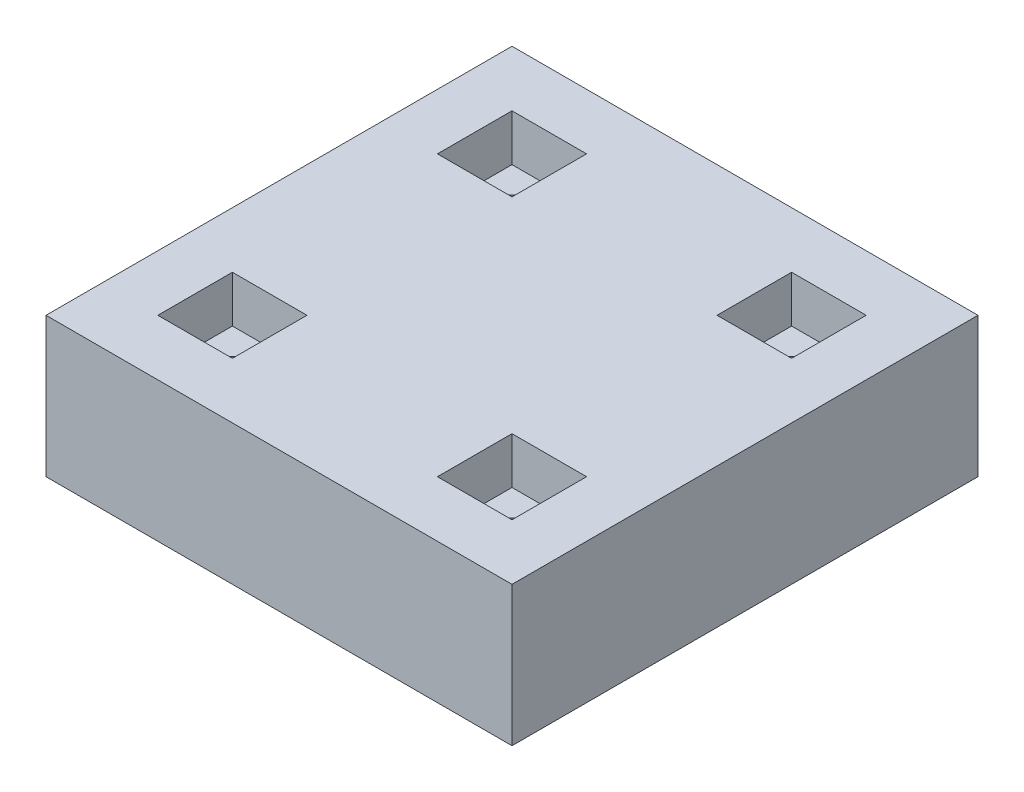
ISO-10303-21;
HEADER;
FILE_DESCRIPTION(('STEP AP214'),'2;1');
FILE_NAME('part.step','',(''),(''),'','','');
FILE_SCHEMA(('AUTOMOTIVE_DESIGN { 1 0 10303 214 1 1 1 1 }'));
ENDSEC;
DATA;
#1=APPLICATION_CONTEXT('core data for automotive mechanical design processes');
#2=APPLICATION_PROTOCOL_DEFINITION('international standard','automotive_design',2000,#1);
#3=PRODUCT_CONTEXT('',#1,'mechanical');
#4=PRODUCT('Part','Part','',(#3));
#5=PRODUCT_RELATED_PRODUCT_CATEGORY('part','',(#4));
#6=PRODUCT_DEFINITION_FORMATION('','',#4);
#7=PRODUCT_DEFINITION_CONTEXT('part definition',#1,'design');
#8=PRODUCT_DEFINITION('design','',#6,#7);
#9=PRODUCT_DEFINITION_SHAPE('','',#8);
#10=(LENGTH_UNIT() NAMED_UNIT(*) SI_UNIT(.MILLI.,.METRE.));
#11=(NAMED_UNIT(*) PLANE_ANGLE_UNIT() SI_UNIT($,.RADIAN.));
#12=(NAMED_UNIT(*) SI_UNIT($,.STERADIAN.) SOLID_ANGLE_UNIT());
#13=UNCERTAINTY_MEASURE_WITH_UNIT(LENGTH_MEASURE(1.E-05),#10,'distance_accuracy_value','');
#14=(GEOMETRIC_REPRESENTATION_CONTEXT(3) GLOBAL_UNCERTAINTY_ASSIGNED_CONTEXT((#13)) GLOBAL_UNIT_ASSIGNED_CONTEXT((#10,
#11,#12)) REPRESENTATION_CONTEXT('',''));
#15=CARTESIAN_POINT('',(0.,0.,0.));
#16=DIRECTION('',(0.,0.,1.));
#17=DIRECTION('',(1.,0.,0.));
#18=AXIS2_PLACEMENT_3D('',#15,#16,#17);
#19=CARTESIAN_POINT('',(-15.,15.,15.));
#20=DIRECTION('',(0.,1.,0.));
#21=DIRECTION('',(0.,0.,1.));
#22=AXIS2_PLACEMENT_3D('',#19,#20,#21);
#23=CYLINDRICAL_SURFACE('',#22,1.65);
#24=CARTESIAN_POINT('',(-15.,0.,15.));
#25=DIRECTION('',(0.,1.,0.));
#26=DIRECTION('',(0.,0.,1.));
#27=AXIS2_PLACEMENT_3D('',#24,#25,#26);
#28=CIRCLE('',#27,1.65);
#29=CARTESIAN_POINT('',(-15.,0.,16.65));
#30=VERTEX_POINT('',#29);
#31=EDGE_CURVE('E322',#30,#30,#28,.T.);
#32=ORIENTED_EDGE('',*,*,#31,.F.);
#33=EDGE_LOOP('',(#32));
#34=FACE_BOUND('',#33,.T.);
#35=CARTESIAN_POINT('',(-15.,10.,15.));
#36=DIRECTION('',(0.,1.,0.));
#37=DIRECTION('',(0.,0.,1.));
#38=AXIS2_PLACEMENT_3D('',#35,#36,#37);
#39=CIRCLE('',#38,1.65);
#40=CARTESIAN_POINT('',(-15.,10.,16.65));
#41=VERTEX_POINT('',#40);
#42=EDGE_CURVE('E42',#41,#41,#39,.F.);
#43=ORIENTED_EDGE('',*,*,#42,.F.);
#44=EDGE_LOOP('',(#43));
#45=FACE_BOUND('',#44,.T.);
#46=ADVANCED_FACE('F38',(#34,#45),#23,.F.);
#47=CARTESIAN_POINT('',(14.9999999999999,15.,15.));
#48=DIRECTION('',(0.,1.,0.));
#49=DIRECTION('',(0.,0.,1.));
#50=AXIS2_PLACEMENT_3D('',#47,#48,#49);
#51=CYLINDRICAL_SURFACE('',#50,1.65);
#52=CARTESIAN_POINT('',(14.9999999999999,0.,15.));
#53=DIRECTION('',(0.,1.,0.));
#54=DIRECTION('',(0.,0.,1.));
#55=AXIS2_PLACEMENT_3D('',#52,#53,#54);
#56=CIRCLE('',#55,1.65);
#57=CARTESIAN_POINT('',(14.9999999999999,0.,16.65));
#58=VERTEX_POINT('',#57);
#59=EDGE_CURVE('E319',#58,#58,#56,.T.);
#60=ORIENTED_EDGE('',*,*,#59,.F.);
#61=EDGE_LOOP('',(#60));
#62=FACE_BOUND('',#61,.T.);
#63=CARTESIAN_POINT('',(14.9999999999999,10.,15.));
#64=DIRECTION('',(0.,1.,0.));
#65=DIRECTION('',(0.,0.,1.));
#66=AXIS2_PLACEMENT_3D('',#63,#64,#65);
#67=CIRCLE('',#66,1.65);
#68=CARTESIAN_POINT('',(14.9999999999999,10.,16.65));
#69=VERTEX_POINT('',#68);
#70=EDGE_CURVE('E355',#69,#69,#67,.F.);
#71=ORIENTED_EDGE('',*,*,#70,.F.);
#72=EDGE_LOOP('',(#71));
#73=FACE_BOUND('',#72,.T.);
#74=ADVANCED_FACE('F365',(#62,#73),#51,.F.);
#75=CARTESIAN_POINT('',(14.9999999999999,15.,-15.));
#76=DIRECTION('',(0.,1.,0.));
#77=DIRECTION('',(0.,0.,1.));
#78=AXIS2_PLACEMENT_3D('',#75,#76,#77);
#79=CYLINDRICAL_SURFACE('',#78,1.65);
#80=CARTESIAN_POINT('',(14.9999999999999,0.,-15.));
#81=DIRECTION('',(0.,1.,0.));
#82=DIRECTION('',(0.,0.,1.));
#83=AXIS2_PLACEMENT_3D('',#80,#81,#82);
#84=CIRCLE('',#83,1.65);
#85=CARTESIAN_POINT('',(14.9999999999999,0.,-13.35));
#86=VERTEX_POINT('',#85);
#87=EDGE_CURVE('E316',#86,#86,#84,.T.);
#88=ORIENTED_EDGE('',*,*,#87,.F.);
#89=EDGE_LOOP('',(#88));
#90=FACE_BOUND('',#89,.T.);
#91=CARTESIAN_POINT('',(14.9999999999999,10.,-15.));
#92=DIRECTION('',(0.,1.,0.));
#93=DIRECTION('',(0.,0.,1.));
#94=AXIS2_PLACEMENT_3D('',#91,#92,#93);
#95=CIRCLE('',#94,1.65);
#96=CARTESIAN_POINT('',(14.9999999999999,10.,-13.35));
#97=VERTEX_POINT('',#96);
#98=EDGE_CURVE('E353',#97,#97,#95,.F.);
#99=ORIENTED_EDGE('',*,*,#98,.F.);
#100=EDGE_LOOP('',(#99));
#101=FACE_BOUND('',#100,.T.);
#102=ADVANCED_FACE('F371',(#90,#101),#79,.F.);
#103=CARTESIAN_POINT('',(-25.,15.,-25.));
#104=DIRECTION('',(1.,0.,0.));
#105=DIRECTION('',(0.,0.,-1.));
#106=AXIS2_PLACEMENT_3D('',#103,#104,#105);
#107=PLANE('',#106);
#108=DIRECTION('',(0.,0.,1.));
#109=VECTOR('',#108,1.);
#110=CARTESIAN_POINT('',(-25.,0.,-25.));
#111=LINE('',#110,#109);
#112=CARTESIAN_POINT('',(-25.,0.,-25.));
#113=VERTEX_POINT('',#112);
#114=CARTESIAN_POINT('',(-25.,0.,25.));
#115=VERTEX_POINT('',#114);
#116=EDGE_CURVE('E325',#113,#115,#111,.T.);
#117=ORIENTED_EDGE('',*,*,#116,.T.);
#118=DIRECTION('',(0.,-1.,0.));
#119=VECTOR('',#118,1.);
#120=CARTESIAN_POINT('',(-25.,15.,25.));
#121=LINE('',#120,#119);
#122=CARTESIAN_POINT('',(-25.,15.,25.));
#123=VERTEX_POINT('',#122);
#124=EDGE_CURVE('E11',#123,#115,#121,.T.);
#125=ORIENTED_EDGE('',*,*,#124,.F.);
#126=DIRECTION('',(0.,0.,1.));
#127=VECTOR('',#126,1.);
#128=CARTESIAN_POINT('',(-25.,15.,-25.));
#129=LINE('',#128,#127);
#130=CARTESIAN_POINT('',(-25.,15.,-25.));
#131=VERTEX_POINT('',#130);
#132=EDGE_CURVE('E326',#131,#123,#129,.T.);
#133=ORIENTED_EDGE('',*,*,#132,.F.);
#134=DIRECTION('',(0.,-1.,0.));
#135=VECTOR('',#134,1.);
#136=CARTESIAN_POINT('',(-25.,15.,-25.));
#137=LINE('',#136,#135);
#138=EDGE_CURVE('E336',#131,#113,#137,.T.);
#139=ORIENTED_EDGE('',*,*,#138,.T.);
#140=EDGE_LOOP('',(#117,#125,#133,#139));
#141=FACE_BOUND('',#140,.T.);
#142=ADVANCED_FACE('F40',(#141),#107,.F.);
#143=CARTESIAN_POINT('',(25.,15.,25.));
#144=DIRECTION('',(0.,0.,-1.));
#145=DIRECTION('',(-1.,0.,0.));
#146=AXIS2_PLACEMENT_3D('',#143,#144,#145);
#147=PLANE('',#146);
#148=DIRECTION('',(1.,0.,0.));
#149=VECTOR('',#148,1.);
#150=CARTESIAN_POINT('',(25.,0.,25.));
#151=LINE('',#150,#149);
#152=CARTESIAN_POINT('',(25.,0.,25.));
#153=VERTEX_POINT('',#152);
#154=EDGE_CURVE('E339',#115,#153,#151,.T.);
#155=ORIENTED_EDGE('',*,*,#154,.T.);
#156=DIRECTION('',(0.,-1.,0.));
#157=VECTOR('',#156,1.);
#158=CARTESIAN_POINT('',(25.,15.,25.));
#159=LINE('',#158,#157);
#160=CARTESIAN_POINT('',(25.,15.,25.));
#161=VERTEX_POINT('',#160);
#162=EDGE_CURVE('E47',#161,#153,#159,.T.);
#163=ORIENTED_EDGE('',*,*,#162,.F.);
#164=DIRECTION('',(1.,0.,0.));
#165=VECTOR('',#164,1.);
#166=CARTESIAN_POINT('',(25.,15.,25.));
#167=LINE('',#166,#165);
#168=EDGE_CURVE('E329',#123,#161,#167,.T.);
#169=ORIENTED_EDGE('',*,*,#168,.F.);
#170=ORIENTED_EDGE('',*,*,#124,.T.);
#171=EDGE_LOOP('',(#155,#163,#169,#170));
#172=FACE_BOUND('',#171,.T.);
#173=ADVANCED_FACE('F392',(#172),#147,.F.);
#174=CARTESIAN_POINT('',(25.,15.,-25.));
#175=DIRECTION('',(-1.,0.,0.));
#176=DIRECTION('',(0.,0.,1.));
#177=AXIS2_PLACEMENT_3D('',#174,#175,#176);
#178=PLANE('',#177);
#179=DIRECTION('',(0.,0.,-1.));
#180=VECTOR('',#179,1.);
#181=CARTESIAN_POINT('',(25.,0.,-25.));
#182=LINE('',#181,#180);
#183=CARTESIAN_POINT('',(25.,0.,-25.));
#184=VERTEX_POINT('',#183);
#185=EDGE_CURVE('E341',#153,#184,#182,.T.);
#186=ORIENTED_EDGE('',*,*,#185,.T.);
#187=DIRECTION('',(0.,-1.,0.));
#188=VECTOR('',#187,1.);
#189=CARTESIAN_POINT('',(25.,15.,-25.));
#190=LINE('',#189,#188);
#191=CARTESIAN_POINT('',(25.,15.,-25.));
#192=VERTEX_POINT('',#191);
#193=EDGE_CURVE('E346',#192,#184,#190,.T.);
#194=ORIENTED_EDGE('',*,*,#193,.F.);
#195=DIRECTION('',(0.,0.,-1.));
#196=VECTOR('',#195,1.);
#197=CARTESIAN_POINT('',(25.,15.,-25.));
#198=LINE('',#197,#196);
#199=EDGE_CURVE('E332',#161,#192,#198,.T.);
#200=ORIENTED_EDGE('',*,*,#199,.F.);
#201=ORIENTED_EDGE('',*,*,#162,.T.);
#202=EDGE_LOOP('',(#186,#194,#200,#201));
#203=FACE_BOUND('',#202,.T.);
#204=ADVANCED_FACE('F389',(#203),#178,.F.);
#205=CARTESIAN_POINT('',(25.,15.,-25.));
#206=DIRECTION('',(0.,0.,1.));
#207=DIRECTION('',(1.,0.,0.));
#208=AXIS2_PLACEMENT_3D('',#205,#206,#207);
#209=PLANE('',#208);
#210=DIRECTION('',(-1.,0.,0.));
#211=VECTOR('',#210,1.);
#212=CARTESIAN_POINT('',(25.,0.,-25.));
#213=LINE('',#212,#211);
#214=EDGE_CURVE('E330',#184,#113,#213,.T.);
#215=ORIENTED_EDGE('',*,*,#214,.T.);
#216=ORIENTED_EDGE('',*,*,#138,.F.);
#217=DIRECTION('',(-1.,0.,0.));
#218=VECTOR('',#217,1.);
#219=CARTESIAN_POINT('',(25.,15.,-25.));
#220=LINE('',#219,#218);
#221=EDGE_CURVE('E334',#192,#131,#220,.T.);
#222=ORIENTED_EDGE('',*,*,#221,.F.);
#223=ORIENTED_EDGE('',*,*,#193,.T.);
#224=EDGE_LOOP('',(#215,#216,#222,#223));
#225=FACE_BOUND('',#224,.T.);
#226=ADVANCED_FACE('F381',(#225),#209,.F.);
#227=CARTESIAN_POINT('',(0.,15.,0.));
#228=DIRECTION('',(0.,-1.,0.));
#229=DIRECTION('',(0.,0.,-1.));
#230=AXIS2_PLACEMENT_3D('',#227,#228,#229);
#231=PLANE('',#230);
#232=DIRECTION('',(0.,0.,1.));
#233=VECTOR('',#232,1.);
#234=CARTESIAN_POINT('',(11.,15.,11.));
#235=LINE('',#234,#233);
#236=CARTESIAN_POINT('',(11.,15.,11.));
#237=VERTEX_POINT('',#236);
#238=CARTESIAN_POINT('',(11.,15.,19.));
#239=VERTEX_POINT('',#238);
#240=EDGE_CURVE('E267',#237,#239,#235,.T.);
#241=ORIENTED_EDGE('',*,*,#240,.F.);
#242=DIRECTION('',(-1.,0.,0.));
#243=VECTOR('',#242,1.);
#244=CARTESIAN_POINT('',(19.,15.,11.));
#245=LINE('',#244,#243);
#246=CARTESIAN_POINT('',(19.,15.,11.));
#247=VERTEX_POINT('',#246);
#248=EDGE_CURVE('E55',#247,#237,#245,.T.);
#249=ORIENTED_EDGE('',*,*,#248,.F.);
#250=DIRECTION('',(0.,0.,-1.));
#251=VECTOR('',#250,1.);
#252=CARTESIAN_POINT('',(19.,15.,11.));
#253=LINE('',#252,#251);
#254=CARTESIAN_POINT('',(19.,15.,19.));
#255=VERTEX_POINT('',#254);
#256=EDGE_CURVE('E256',#255,#247,#253,.T.);
#257=ORIENTED_EDGE('',*,*,#256,.F.);
#258=DIRECTION('',(1.,0.,0.));
#259=VECTOR('',#258,1.);
#260=CARTESIAN_POINT('',(19.,15.,19.));
#261=LINE('',#260,#259);
#262=EDGE_CURVE('E270',#239,#255,#261,.T.);
#263=ORIENTED_EDGE('',*,*,#262,.F.);
#264=EDGE_LOOP('',(#241,#249,#257,#263));
#265=FACE_BOUND('',#264,.T.);
#266=DIRECTION('',(1.,0.,0.));
#267=VECTOR('',#266,1.);
#268=CARTESIAN_POINT('',(-19.,15.,19.));
#269=LINE('',#268,#267);
#270=CARTESIAN_POINT('',(-19.,15.,19.));
#271=VERTEX_POINT('',#270);
#272=CARTESIAN_POINT('',(-11.,15.,19.));
#273=VERTEX_POINT('',#272);
#274=EDGE_CURVE('E237',#271,#273,#269,.T.);
#275=ORIENTED_EDGE('',*,*,#274,.F.);
#276=DIRECTION('',(0.,0.,1.));
#277=VECTOR('',#276,1.);
#278=CARTESIAN_POINT('',(-19.,15.,11.));
#279=LINE('',#278,#277);
#280=CARTESIAN_POINT('',(-19.,15.,11.));
#281=VERTEX_POINT('',#280);
#282=EDGE_CURVE('E63',#281,#271,#279,.T.);
#283=ORIENTED_EDGE('',*,*,#282,.F.);
#284=DIRECTION('',(-1.,0.,0.));
#285=VECTOR('',#284,1.);
#286=CARTESIAN_POINT('',(-19.,15.,11.));
#287=LINE('',#286,#285);
#288=CARTESIAN_POINT('',(-11.,15.,11.));
#289=VERTEX_POINT('',#288);
#290=EDGE_CURVE('E226',#289,#281,#287,.T.);
#291=ORIENTED_EDGE('',*,*,#290,.F.);
#292=DIRECTION('',(0.,0.,-1.));
#293=VECTOR('',#292,1.);
#294=CARTESIAN_POINT('',(-11.,15.,11.));
#295=LINE('',#294,#293);
#296=EDGE_CURVE('E241',#273,#289,#295,.T.);
#297=ORIENTED_EDGE('',*,*,#296,.F.);
#298=EDGE_LOOP('',(#275,#283,#291,#297));
#299=FACE_BOUND('',#298,.T.);
#300=DIRECTION('',(-1.,0.,0.));
#301=VECTOR('',#300,1.);
#302=CARTESIAN_POINT('',(-19.,15.,-19.));
#303=LINE('',#302,#301);
#304=CARTESIAN_POINT('',(-11.,15.,-19.));
#305=VERTEX_POINT('',#304);
#306=CARTESIAN_POINT('',(-19.,15.,-19.));
#307=VERTEX_POINT('',#306);
#308=EDGE_CURVE('E211',#305,#307,#303,.T.);
#309=ORIENTED_EDGE('',*,*,#308,.F.);
#310=DIRECTION('',(0.,0.,-1.));
#311=VECTOR('',#310,1.);
#312=CARTESIAN_POINT('',(-11.,15.,-11.));
#313=LINE('',#312,#311);
#314=CARTESIAN_POINT('',(-11.,15.,-11.));
#315=VERTEX_POINT('',#314);
#316=EDGE_CURVE('E184',#315,#305,#313,.T.);
#317=ORIENTED_EDGE('',*,*,#316,.F.);
#318=DIRECTION('',(1.,0.,0.));
#319=VECTOR('',#318,1.);
#320=CARTESIAN_POINT('',(-19.,15.,-11.));
#321=LINE('',#320,#319);
#322=CARTESIAN_POINT('',(-19.,15.,-11.));
#323=VERTEX_POINT('',#322);
#324=EDGE_CURVE('E202',#323,#315,#321,.T.);
#325=ORIENTED_EDGE('',*,*,#324,.F.);
#326=DIRECTION('',(0.,0.,1.));
#327=VECTOR('',#326,1.);
#328=CARTESIAN_POINT('',(-19.,15.,-11.));
#329=LINE('',#328,#327);
#330=EDGE_CURVE('E205',#307,#323,#329,.T.);
#331=ORIENTED_EDGE('',*,*,#330,.F.);
#332=EDGE_LOOP('',(#309,#317,#325,#331));
#333=FACE_BOUND('',#332,.T.);
#334=DIRECTION('',(-1.,0.,0.));
#335=VECTOR('',#334,1.);
#336=CARTESIAN_POINT('',(19.,15.,-19.));
#337=LINE('',#336,#335);
#338=CARTESIAN_POINT('',(19.,15.,-19.));
#339=VERTEX_POINT('',#338);
#340=CARTESIAN_POINT('',(11.,15.,-19.));
#341=VERTEX_POINT('',#340);
#342=EDGE_CURVE('E296',#339,#341,#337,.T.);
#343=ORIENTED_EDGE('',*,*,#342,.F.);
#344=DIRECTION('',(0.,0.,-1.));
#345=VECTOR('',#344,1.);
#346=CARTESIAN_POINT('',(19.,15.,-11.));
#347=LINE('',#346,#345);
#348=CARTESIAN_POINT('',(19.,15.,-11.));
#349=VERTEX_POINT('',#348);
#350=EDGE_CURVE('E218',#349,#339,#347,.T.);
#351=ORIENTED_EDGE('',*,*,#350,.F.);
#352=DIRECTION('',(1.,0.,0.));
#353=VECTOR('',#352,1.);
#354=CARTESIAN_POINT('',(19.,15.,-11.));
#355=LINE('',#354,#353);
#356=CARTESIAN_POINT('',(11.,15.,-11.));
#357=VERTEX_POINT('',#356);
#358=EDGE_CURVE('E285',#357,#349,#355,.T.);
#359=ORIENTED_EDGE('',*,*,#358,.F.);
#360=DIRECTION('',(0.,0.,1.));
#361=VECTOR('',#360,1.);
#362=CARTESIAN_POINT('',(11.,15.,-11.));
#363=LINE('',#362,#361);
#364=EDGE_CURVE('E299',#341,#357,#363,.T.);
#365=ORIENTED_EDGE('',*,*,#364,.F.);
#366=EDGE_LOOP('',(#343,#351,#359,#365));
#367=FACE_BOUND('',#366,.T.);
#368=ORIENTED_EDGE('',*,*,#132,.T.);
#369=ORIENTED_EDGE('',*,*,#168,.T.);
#370=ORIENTED_EDGE('',*,*,#199,.T.);
#371=ORIENTED_EDGE('',*,*,#221,.T.);
#372=EDGE_LOOP('',(#368,#369,#370,#371));
#373=FACE_BOUND('',#372,.T.);
#374=ADVANCED_FACE('F377',(#265,#299,#333,#367,#373),#231,.F.);
#375=CARTESIAN_POINT('',(0.,0.,0.));
#376=DIRECTION('',(0.,-1.,0.));
#377=DIRECTION('',(0.,0.,-1.));
#378=AXIS2_PLACEMENT_3D('',#375,#376,#377);
#379=PLANE('',#378);
#380=CARTESIAN_POINT('',(-15.,0.,-15.));
#381=DIRECTION('',(0.,1.,0.));
#382=DIRECTION('',(0.,0.,1.));
#383=AXIS2_PLACEMENT_3D('',#380,#381,#382);
#384=CIRCLE('',#383,1.65);
#385=CARTESIAN_POINT('',(-15.,0.,-13.35));
#386=VERTEX_POINT('',#385);
#387=EDGE_CURVE('E313',#386,#386,#384,.T.);
#388=ORIENTED_EDGE('',*,*,#387,.T.);
#389=EDGE_LOOP('',(#388));
#390=FACE_BOUND('',#389,.T.);
#391=ORIENTED_EDGE('',*,*,#87,.T.);
#392=EDGE_LOOP('',(#391));
#393=FACE_BOUND('',#392,.T.);
#394=ORIENTED_EDGE('',*,*,#59,.T.);
#395=EDGE_LOOP('',(#394));
#396=FACE_BOUND('',#395,.T.);
#397=ORIENTED_EDGE('',*,*,#31,.T.);
#398=EDGE_LOOP('',(#397));
#399=FACE_BOUND('',#398,.T.);
#400=ORIENTED_EDGE('',*,*,#116,.F.);
#401=ORIENTED_EDGE('',*,*,#214,.F.);
#402=ORIENTED_EDGE('',*,*,#185,.F.);
#403=ORIENTED_EDGE('',*,*,#154,.F.);
#404=EDGE_LOOP('',(#400,#401,#402,#403));
#405=FACE_BOUND('',#404,.T.);
#406=ADVANCED_FACE('F380',(#390,#393,#396,#399,#405),#379,.T.);
#407=CARTESIAN_POINT('',(-15.,15.,-15.));
#408=DIRECTION('',(0.,1.,0.));
#409=DIRECTION('',(0.,0.,1.));
#410=AXIS2_PLACEMENT_3D('',#407,#408,#409);
#411=CYLINDRICAL_SURFACE('',#410,1.65);
#412=CARTESIAN_POINT('',(-15.,10.,-15.));
#413=DIRECTION('',(0.,-1.,0.));
#414=DIRECTION('',(0.,0.,-1.));
#415=AXIS2_PLACEMENT_3D('',#412,#413,#414);
#416=CIRCLE('',#415,1.65);
#417=CARTESIAN_POINT('',(-15.,10.,-16.65));
#418=VERTEX_POINT('',#417);
#419=EDGE_CURVE('E306',#418,#418,#416,.F.);
#420=ORIENTED_EDGE('',*,*,#419,.T.);
#421=EDGE_LOOP('',(#420));
#422=FACE_BOUND('',#421,.T.);
#423=ORIENTED_EDGE('',*,*,#387,.F.);
#424=EDGE_LOOP('',(#423));
#425=FACE_BOUND('',#424,.T.);
#426=ADVANCED_FACE('F385',(#422,#425),#411,.F.);
#427=CARTESIAN_POINT('',(0.,10.,0.));
#428=DIRECTION('',(0.,-1.,0.));
#429=DIRECTION('',(0.,0.,-1.));
#430=AXIS2_PLACEMENT_3D('',#427,#428,#429);
#431=PLANE('',#430);
#432=DIRECTION('',(0.,0.,-1.));
#433=VECTOR('',#432,1.);
#434=CARTESIAN_POINT('',(-11.,10.,-11.));
#435=LINE('',#434,#433);
#436=CARTESIAN_POINT('',(-11.,10.,-11.));
#437=VERTEX_POINT('',#436);
#438=CARTESIAN_POINT('',(-11.,10.,-19.));
#439=VERTEX_POINT('',#438);
#440=EDGE_CURVE('E181',#437,#439,#435,.T.);
#441=ORIENTED_EDGE('',*,*,#440,.T.);
#442=DIRECTION('',(-1.,0.,0.));
#443=VECTOR('',#442,1.);
#444=CARTESIAN_POINT('',(-19.,10.,-19.));
#445=LINE('',#444,#443);
#446=CARTESIAN_POINT('',(-19.,10.,-19.));
#447=VERTEX_POINT('',#446);
#448=EDGE_CURVE('E192',#439,#447,#445,.T.);
#449=ORIENTED_EDGE('',*,*,#448,.T.);
#450=DIRECTION('',(0.,0.,1.));
#451=VECTOR('',#450,1.);
#452=CARTESIAN_POINT('',(-19.,10.,-11.));
#453=LINE('',#452,#451);
#454=CARTESIAN_POINT('',(-19.,10.,-11.));
#455=VERTEX_POINT('',#454);
#456=EDGE_CURVE('E197',#447,#455,#453,.T.);
#457=ORIENTED_EDGE('',*,*,#456,.T.);
#458=DIRECTION('',(1.,0.,0.));
#459=VECTOR('',#458,1.);
#460=CARTESIAN_POINT('',(-19.,10.,-11.));
#461=LINE('',#460,#459);
#462=EDGE_CURVE('E189',#455,#437,#461,.T.);
#463=ORIENTED_EDGE('',*,*,#462,.T.);
#464=EDGE_LOOP('',(#441,#449,#457,#463));
#465=FACE_BOUND('',#464,.T.);
#466=ORIENTED_EDGE('',*,*,#419,.F.);
#467=EDGE_LOOP('',(#466));
#468=FACE_BOUND('',#467,.T.);
#469=ADVANCED_FACE('F199',(#465,#468),#431,.F.);
#470=CARTESIAN_POINT('',(-11.,10.,-11.));
#471=DIRECTION('',(1.,0.,0.));
#472=DIRECTION('',(0.,0.,-1.));
#473=AXIS2_PLACEMENT_3D('',#470,#471,#472);
#474=PLANE('',#473);
#475=ORIENTED_EDGE('',*,*,#316,.T.);
#476=DIRECTION('',(0.,1.,0.));
#477=VECTOR('',#476,1.);
#478=CARTESIAN_POINT('',(-11.,10.,-19.));
#479=LINE('',#478,#477);
#480=EDGE_CURVE('E177',#439,#305,#479,.T.);
#481=ORIENTED_EDGE('',*,*,#480,.F.);
#482=ORIENTED_EDGE('',*,*,#440,.F.);
#483=DIRECTION('',(0.,1.,0.));
#484=VECTOR('',#483,1.);
#485=CARTESIAN_POINT('',(-11.,10.,-11.));
#486=LINE('',#485,#484);
#487=EDGE_CURVE('E216',#437,#315,#486,.T.);
#488=ORIENTED_EDGE('',*,*,#487,.T.);
#489=EDGE_LOOP('',(#475,#481,#482,#488));
#490=FACE_BOUND('',#489,.T.);
#491=ADVANCED_FACE('F179',(#490),#474,.F.);
#492=CARTESIAN_POINT('',(-19.,10.,-11.));
#493=DIRECTION('',(0.,0.,1.));
#494=DIRECTION('',(1.,0.,0.));
#495=AXIS2_PLACEMENT_3D('',#492,#493,#494);
#496=PLANE('',#495);
#497=ORIENTED_EDGE('',*,*,#324,.T.);
#498=ORIENTED_EDGE('',*,*,#487,.F.);
#499=ORIENTED_EDGE('',*,*,#462,.F.);
#500=DIRECTION('',(0.,1.,0.));
#501=VECTOR('',#500,1.);
#502=CARTESIAN_POINT('',(-19.,10.,-11.));
#503=LINE('',#502,#501);
#504=EDGE_CURVE('E219',#455,#323,#503,.T.);
#505=ORIENTED_EDGE('',*,*,#504,.T.);
#506=EDGE_LOOP('',(#497,#498,#499,#505));
#507=FACE_BOUND('',#506,.T.);
#508=ADVANCED_FACE('F483',(#507),#496,.F.);
#509=CARTESIAN_POINT('',(-19.,10.,-11.));
#510=DIRECTION('',(-1.,0.,0.));
#511=DIRECTION('',(0.,0.,1.));
#512=AXIS2_PLACEMENT_3D('',#509,#510,#511);
#513=PLANE('',#512);
#514=ORIENTED_EDGE('',*,*,#330,.T.);
#515=ORIENTED_EDGE('',*,*,#504,.F.);
#516=ORIENTED_EDGE('',*,*,#456,.F.);
#517=DIRECTION('',(0.,1.,0.));
#518=VECTOR('',#517,1.);
#519=CARTESIAN_POINT('',(-19.,10.,-19.));
#520=LINE('',#519,#518);
#521=EDGE_CURVE('E188',#447,#307,#520,.T.);
#522=ORIENTED_EDGE('',*,*,#521,.T.);
#523=EDGE_LOOP('',(#514,#515,#516,#522));
#524=FACE_BOUND('',#523,.T.);
#525=ADVANCED_FACE('F486',(#524),#513,.F.);
#526=CARTESIAN_POINT('',(-19.,10.,-19.));
#527=DIRECTION('',(0.,0.,-1.));
#528=DIRECTION('',(-1.,0.,0.));
#529=AXIS2_PLACEMENT_3D('',#526,#527,#528);
#530=PLANE('',#529);
#531=ORIENTED_EDGE('',*,*,#308,.T.);
#532=ORIENTED_EDGE('',*,*,#521,.F.);
#533=ORIENTED_EDGE('',*,*,#448,.F.);
#534=ORIENTED_EDGE('',*,*,#480,.T.);
#535=EDGE_LOOP('',(#531,#532,#533,#534));
#536=FACE_BOUND('',#535,.T.);
#537=ADVANCED_FACE('F193',(#536),#530,.F.);
#538=CARTESIAN_POINT('',(0.,10.,0.));
#539=DIRECTION('',(0.,1.,0.));
#540=DIRECTION('',(0.,0.,1.));
#541=AXIS2_PLACEMENT_3D('',#538,#539,#540);
#542=PLANE('',#541);
#543=DIRECTION('',(0.,0.,-1.));
#544=VECTOR('',#543,1.);
#545=CARTESIAN_POINT('',(19.,10.,-11.));
#546=LINE('',#545,#544);
#547=CARTESIAN_POINT('',(19.,10.,-11.));
#548=VERTEX_POINT('',#547);
#549=CARTESIAN_POINT('',(19.,10.,-19.));
#550=VERTEX_POINT('',#549);
#551=EDGE_CURVE('E281',#548,#550,#546,.T.);
#552=ORIENTED_EDGE('',*,*,#551,.T.);
#553=DIRECTION('',(-1.,0.,0.));
#554=VECTOR('',#553,1.);
#555=CARTESIAN_POINT('',(19.,10.,-19.));
#556=LINE('',#555,#554);
#557=CARTESIAN_POINT('',(11.,10.,-19.));
#558=VERTEX_POINT('',#557);
#559=EDGE_CURVE('E284',#550,#558,#556,.T.);
#560=ORIENTED_EDGE('',*,*,#559,.T.);
#561=DIRECTION('',(0.,0.,1.));
#562=VECTOR('',#561,1.);
#563=CARTESIAN_POINT('',(11.,10.,-11.));
#564=LINE('',#563,#562);
#565=CARTESIAN_POINT('',(11.,10.,-11.));
#566=VERTEX_POINT('',#565);
#567=EDGE_CURVE('E288',#558,#566,#564,.T.);
#568=ORIENTED_EDGE('',*,*,#567,.T.);
#569=DIRECTION('',(1.,0.,0.));
#570=VECTOR('',#569,1.);
#571=CARTESIAN_POINT('',(19.,10.,-11.));
#572=LINE('',#571,#570);
#573=EDGE_CURVE('E291',#566,#548,#572,.T.);
#574=ORIENTED_EDGE('',*,*,#573,.T.);
#575=EDGE_LOOP('',(#552,#560,#568,#574));
#576=FACE_BOUND('',#575,.T.);
#577=ORIENTED_EDGE('',*,*,#98,.T.);
#578=EDGE_LOOP('',(#577));
#579=FACE_BOUND('',#578,.T.);
#580=ADVANCED_FACE('F428',(#576,#579),#542,.T.);
#581=CARTESIAN_POINT('',(19.,10.,-11.));
#582=DIRECTION('',(1.,0.,0.));
#583=DIRECTION('',(0.,0.,-1.));
#584=AXIS2_PLACEMENT_3D('',#581,#582,#583);
#585=PLANE('',#584);
#586=ORIENTED_EDGE('',*,*,#350,.T.);
#587=DIRECTION('',(0.,1.,0.));
#588=VECTOR('',#587,1.);
#589=CARTESIAN_POINT('',(19.,10.,-19.));
#590=LINE('',#589,#588);
#591=EDGE_CURVE('E294',#550,#339,#590,.T.);
#592=ORIENTED_EDGE('',*,*,#591,.F.);
#593=ORIENTED_EDGE('',*,*,#551,.F.);
#594=DIRECTION('',(0.,1.,0.));
#595=VECTOR('',#594,1.);
#596=CARTESIAN_POINT('',(19.,10.,-11.));
#597=LINE('',#596,#595);
#598=EDGE_CURVE('E304',#548,#349,#597,.T.);
#599=ORIENTED_EDGE('',*,*,#598,.T.);
#600=EDGE_LOOP('',(#586,#592,#593,#599));
#601=FACE_BOUND('',#600,.T.);
#602=ADVANCED_FACE('F424',(#601),#585,.F.);
#603=CARTESIAN_POINT('',(19.,10.,-11.));
#604=DIRECTION('',(0.,0.,1.));
#605=DIRECTION('',(1.,0.,0.));
#606=AXIS2_PLACEMENT_3D('',#603,#604,#605);
#607=PLANE('',#606);
#608=ORIENTED_EDGE('',*,*,#358,.T.);
#609=ORIENTED_EDGE('',*,*,#598,.F.);
#610=ORIENTED_EDGE('',*,*,#573,.F.);
#611=DIRECTION('',(0.,1.,0.));
#612=VECTOR('',#611,1.);
#613=CARTESIAN_POINT('',(11.,10.,-11.));
#614=LINE('',#613,#612);
#615=EDGE_CURVE('E307',#566,#357,#614,.T.);
#616=ORIENTED_EDGE('',*,*,#615,.T.);
#617=EDGE_LOOP('',(#608,#609,#610,#616));
#618=FACE_BOUND('',#617,.T.);
#619=ADVANCED_FACE('F427',(#618),#607,.F.);
#620=CARTESIAN_POINT('',(11.,10.,-11.));
#621=DIRECTION('',(-1.,0.,0.));
#622=DIRECTION('',(0.,0.,1.));
#623=AXIS2_PLACEMENT_3D('',#620,#621,#622);
#624=PLANE('',#623);
#625=ORIENTED_EDGE('',*,*,#364,.T.);
#626=ORIENTED_EDGE('',*,*,#615,.F.);
#627=ORIENTED_EDGE('',*,*,#567,.F.);
#628=DIRECTION('',(0.,1.,0.));
#629=VECTOR('',#628,1.);
#630=CARTESIAN_POINT('',(11.,10.,-19.));
#631=LINE('',#630,#629);
#632=EDGE_CURVE('E309',#558,#341,#631,.T.);
#633=ORIENTED_EDGE('',*,*,#632,.T.);
#634=EDGE_LOOP('',(#625,#626,#627,#633));
#635=FACE_BOUND('',#634,.T.);
#636=ADVANCED_FACE('F434',(#635),#624,.F.);
#637=CARTESIAN_POINT('',(19.,10.,-19.));
#638=DIRECTION('',(0.,0.,-1.));
#639=DIRECTION('',(-1.,0.,0.));
#640=AXIS2_PLACEMENT_3D('',#637,#638,#639);
#641=PLANE('',#640);
#642=ORIENTED_EDGE('',*,*,#342,.T.);
#643=ORIENTED_EDGE('',*,*,#632,.F.);
#644=ORIENTED_EDGE('',*,*,#559,.F.);
#645=ORIENTED_EDGE('',*,*,#591,.T.);
#646=EDGE_LOOP('',(#642,#643,#644,#645));
#647=FACE_BOUND('',#646,.T.);
#648=ADVANCED_FACE('F430',(#647),#641,.F.);
#649=CARTESIAN_POINT('',(0.,10.,0.));
#650=DIRECTION('',(0.,1.,0.));
#651=DIRECTION('',(0.,0.,1.));
#652=AXIS2_PLACEMENT_3D('',#649,#650,#651);
#653=PLANE('',#652);
#654=DIRECTION('',(-1.,0.,0.));
#655=VECTOR('',#654,1.);
#656=CARTESIAN_POINT('',(19.,10.,11.));
#657=LINE('',#656,#655);
#658=CARTESIAN_POINT('',(19.,10.,11.));
#659=VERTEX_POINT('',#658);
#660=CARTESIAN_POINT('',(11.,10.,11.));
#661=VERTEX_POINT('',#660);
#662=EDGE_CURVE('E252',#659,#661,#657,.T.);
#663=ORIENTED_EDGE('',*,*,#662,.T.);
#664=DIRECTION('',(0.,0.,1.));
#665=VECTOR('',#664,1.);
#666=CARTESIAN_POINT('',(11.,10.,11.));
#667=LINE('',#666,#665);
#668=CARTESIAN_POINT('',(11.,10.,19.));
#669=VERTEX_POINT('',#668);
#670=EDGE_CURVE('E255',#661,#669,#667,.T.);
#671=ORIENTED_EDGE('',*,*,#670,.T.);
#672=DIRECTION('',(1.,0.,0.));
#673=VECTOR('',#672,1.);
#674=CARTESIAN_POINT('',(19.,10.,19.));
#675=LINE('',#674,#673);
#676=CARTESIAN_POINT('',(19.,10.,19.));
#677=VERTEX_POINT('',#676);
#678=EDGE_CURVE('E259',#669,#677,#675,.T.);
#679=ORIENTED_EDGE('',*,*,#678,.T.);
#680=DIRECTION('',(0.,0.,-1.));
#681=VECTOR('',#680,1.);
#682=CARTESIAN_POINT('',(19.,10.,11.));
#683=LINE('',#682,#681);
#684=EDGE_CURVE('E262',#677,#659,#683,.T.);
#685=ORIENTED_EDGE('',*,*,#684,.T.);
#686=EDGE_LOOP('',(#663,#671,#679,#685));
#687=FACE_BOUND('',#686,.T.);
#688=ORIENTED_EDGE('',*,*,#70,.T.);
#689=EDGE_LOOP('',(#688));
#690=FACE_BOUND('',#689,.T.);
#691=ADVANCED_FACE('F433',(#687,#690),#653,.T.);
#692=CARTESIAN_POINT('',(19.,10.,11.));
#693=DIRECTION('',(0.,0.,-1.));
#694=DIRECTION('',(-1.,0.,0.));
#695=AXIS2_PLACEMENT_3D('',#692,#693,#694);
#696=PLANE('',#695);
#697=ORIENTED_EDGE('',*,*,#248,.T.);
#698=DIRECTION('',(0.,1.,0.));
#699=VECTOR('',#698,1.);
#700=CARTESIAN_POINT('',(11.,10.,11.));
#701=LINE('',#700,#699);
#702=EDGE_CURVE('E265',#661,#237,#701,.T.);
#703=ORIENTED_EDGE('',*,*,#702,.F.);
#704=ORIENTED_EDGE('',*,*,#662,.F.);
#705=DIRECTION('',(0.,1.,0.));
#706=VECTOR('',#705,1.);
#707=CARTESIAN_POINT('',(19.,10.,11.));
#708=LINE('',#707,#706);
#709=EDGE_CURVE('E238',#659,#247,#708,.T.);
#710=ORIENTED_EDGE('',*,*,#709,.T.);
#711=EDGE_LOOP('',(#697,#703,#704,#710));
#712=FACE_BOUND('',#711,.T.);
#713=ADVANCED_FACE('F445',(#712),#696,.F.);
#714=CARTESIAN_POINT('',(19.,10.,11.));
#715=DIRECTION('',(1.,0.,0.));
#716=DIRECTION('',(0.,0.,-1.));
#717=AXIS2_PLACEMENT_3D('',#714,#715,#716);
#718=PLANE('',#717);
#719=ORIENTED_EDGE('',*,*,#256,.T.);
#720=ORIENTED_EDGE('',*,*,#709,.F.);
#721=ORIENTED_EDGE('',*,*,#684,.F.);
#722=DIRECTION('',(0.,1.,0.));
#723=VECTOR('',#722,1.);
#724=CARTESIAN_POINT('',(19.,10.,19.));
#725=LINE('',#724,#723);
#726=EDGE_CURVE('E276',#677,#255,#725,.T.);
#727=ORIENTED_EDGE('',*,*,#726,.T.);
#728=EDGE_LOOP('',(#719,#720,#721,#727));
#729=FACE_BOUND('',#728,.T.);
#730=ADVANCED_FACE('F448',(#729),#718,.F.);
#731=CARTESIAN_POINT('',(19.,10.,19.));
#732=DIRECTION('',(0.,0.,1.));
#733=DIRECTION('',(1.,0.,0.));
#734=AXIS2_PLACEMENT_3D('',#731,#732,#733);
#735=PLANE('',#734);
#736=ORIENTED_EDGE('',*,*,#262,.T.);
#737=ORIENTED_EDGE('',*,*,#726,.F.);
#738=ORIENTED_EDGE('',*,*,#678,.F.);
#739=DIRECTION('',(0.,1.,0.));
#740=VECTOR('',#739,1.);
#741=CARTESIAN_POINT('',(11.,10.,19.));
#742=LINE('',#741,#740);
#743=EDGE_CURVE('E278',#669,#239,#742,.T.);
#744=ORIENTED_EDGE('',*,*,#743,.T.);
#745=EDGE_LOOP('',(#736,#737,#738,#744));
#746=FACE_BOUND('',#745,.T.);
#747=ADVANCED_FACE('F452',(#746),#735,.F.);
#748=CARTESIAN_POINT('',(11.,10.,11.));
#749=DIRECTION('',(-1.,0.,0.));
#750=DIRECTION('',(0.,0.,1.));
#751=AXIS2_PLACEMENT_3D('',#748,#749,#750);
#752=PLANE('',#751);
#753=ORIENTED_EDGE('',*,*,#240,.T.);
#754=ORIENTED_EDGE('',*,*,#743,.F.);
#755=ORIENTED_EDGE('',*,*,#670,.F.);
#756=ORIENTED_EDGE('',*,*,#702,.T.);
#757=EDGE_LOOP('',(#753,#754,#755,#756));
#758=FACE_BOUND('',#757,.T.);
#759=ADVANCED_FACE('F449',(#758),#752,.F.);
#760=CARTESIAN_POINT('',(0.,10.,0.));
#761=DIRECTION('',(0.,1.,0.));
#762=DIRECTION('',(0.,0.,1.));
#763=AXIS2_PLACEMENT_3D('',#760,#761,#762);
#764=PLANE('',#763);
#765=DIRECTION('',(0.,0.,1.));
#766=VECTOR('',#765,1.);
#767=CARTESIAN_POINT('',(-19.,10.,11.));
#768=LINE('',#767,#766);
#769=CARTESIAN_POINT('',(-19.,10.,11.));
#770=VERTEX_POINT('',#769);
#771=CARTESIAN_POINT('',(-19.,10.,19.));
#772=VERTEX_POINT('',#771);
#773=EDGE_CURVE('E222',#770,#772,#768,.T.);
#774=ORIENTED_EDGE('',*,*,#773,.T.);
#775=DIRECTION('',(1.,0.,0.));
#776=VECTOR('',#775,1.);
#777=CARTESIAN_POINT('',(-19.,10.,19.));
#778=LINE('',#777,#776);
#779=CARTESIAN_POINT('',(-11.,10.,19.));
#780=VERTEX_POINT('',#779);
#781=EDGE_CURVE('E225',#772,#780,#778,.T.);
#782=ORIENTED_EDGE('',*,*,#781,.T.);
#783=DIRECTION('',(0.,0.,-1.));
#784=VECTOR('',#783,1.);
#785=CARTESIAN_POINT('',(-11.,10.,11.));
#786=LINE('',#785,#784);
#787=CARTESIAN_POINT('',(-11.,10.,11.));
#788=VERTEX_POINT('',#787);
#789=EDGE_CURVE('E229',#780,#788,#786,.T.);
#790=ORIENTED_EDGE('',*,*,#789,.T.);
#791=DIRECTION('',(-1.,0.,0.));
#792=VECTOR('',#791,1.);
#793=CARTESIAN_POINT('',(-19.,10.,11.));
#794=LINE('',#793,#792);
#795=EDGE_CURVE('E232',#788,#770,#794,.T.);
#796=ORIENTED_EDGE('',*,*,#795,.T.);
#797=EDGE_LOOP('',(#774,#782,#790,#796));
#798=FACE_BOUND('',#797,.T.);
#799=ORIENTED_EDGE('',*,*,#42,.T.);
#800=EDGE_LOOP('',(#799));
#801=FACE_BOUND('',#800,.T.);
#802=ADVANCED_FACE('F362',(#798,#801),#764,.T.);
#803=CARTESIAN_POINT('',(-19.,10.,11.));
#804=DIRECTION('',(-1.,0.,0.));
#805=DIRECTION('',(0.,0.,1.));
#806=AXIS2_PLACEMENT_3D('',#803,#804,#805);
#807=PLANE('',#806);
#808=ORIENTED_EDGE('',*,*,#282,.T.);
#809=DIRECTION('',(0.,1.,0.));
#810=VECTOR('',#809,1.);
#811=CARTESIAN_POINT('',(-19.,10.,19.));
#812=LINE('',#811,#810);
#813=EDGE_CURVE('E235',#772,#271,#812,.T.);
#814=ORIENTED_EDGE('',*,*,#813,.F.);
#815=ORIENTED_EDGE('',*,*,#773,.F.);
#816=DIRECTION('',(0.,1.,0.));
#817=VECTOR('',#816,1.);
#818=CARTESIAN_POINT('',(-19.,10.,11.));
#819=LINE('',#818,#817);
#820=EDGE_CURVE('E212',#770,#281,#819,.T.);
#821=ORIENTED_EDGE('',*,*,#820,.T.);
#822=EDGE_LOOP('',(#808,#814,#815,#821));
#823=FACE_BOUND('',#822,.T.);
#824=ADVANCED_FACE('F463',(#823),#807,.F.);
#825=CARTESIAN_POINT('',(-19.,10.,11.));
#826=DIRECTION('',(0.,0.,-1.));
#827=DIRECTION('',(-1.,0.,0.));
#828=AXIS2_PLACEMENT_3D('',#825,#826,#827);
#829=PLANE('',#828);
#830=ORIENTED_EDGE('',*,*,#290,.T.);
#831=ORIENTED_EDGE('',*,*,#820,.F.);
#832=ORIENTED_EDGE('',*,*,#795,.F.);
#833=DIRECTION('',(0.,1.,0.));
#834=VECTOR('',#833,1.);
#835=CARTESIAN_POINT('',(-11.,10.,11.));
#836=LINE('',#835,#834);
#837=EDGE_CURVE('E247',#788,#289,#836,.T.);
#838=ORIENTED_EDGE('',*,*,#837,.T.);
#839=EDGE_LOOP('',(#830,#831,#832,#838));
#840=FACE_BOUND('',#839,.T.);
#841=ADVANCED_FACE('F466',(#840),#829,.F.);
#842=CARTESIAN_POINT('',(-11.,10.,11.));
#843=DIRECTION('',(1.,0.,0.));
#844=DIRECTION('',(0.,0.,-1.));
#845=AXIS2_PLACEMENT_3D('',#842,#843,#844);
#846=PLANE('',#845);
#847=ORIENTED_EDGE('',*,*,#296,.T.);
#848=ORIENTED_EDGE('',*,*,#837,.F.);
#849=ORIENTED_EDGE('',*,*,#789,.F.);
#850=DIRECTION('',(0.,1.,0.));
#851=VECTOR('',#850,1.);
#852=CARTESIAN_POINT('',(-11.,10.,19.));
#853=LINE('',#852,#851);
#854=EDGE_CURVE('E249',#780,#273,#853,.T.);
#855=ORIENTED_EDGE('',*,*,#854,.T.);
#856=EDGE_LOOP('',(#847,#848,#849,#855));
#857=FACE_BOUND('',#856,.T.);
#858=ADVANCED_FACE('F470',(#857),#846,.F.);
#859=CARTESIAN_POINT('',(-19.,10.,19.));
#860=DIRECTION('',(0.,0.,1.));
#861=DIRECTION('',(1.,0.,0.));
#862=AXIS2_PLACEMENT_3D('',#859,#860,#861);
#863=PLANE('',#862);
#864=ORIENTED_EDGE('',*,*,#274,.T.);
#865=ORIENTED_EDGE('',*,*,#854,.F.);
#866=ORIENTED_EDGE('',*,*,#781,.F.);
#867=ORIENTED_EDGE('',*,*,#813,.T.);
#868=EDGE_LOOP('',(#864,#865,#866,#867));
#869=FACE_BOUND('',#868,.T.);
#870=ADVANCED_FACE('F467',(#869),#863,.F.);
#871=CLOSED_SHELL('',(#46,#74,#102,#142,#173,#204,#226,#374,#406,#426,#469,#491,#508,#525,#537,
#580,#602,#619,#636,#648,#691,#713,#730,#747,#759,#802,#824,#841,#858,#870));
#872=MANIFOLD_SOLID_BREP('B2',#871);
#873=ADVANCED_BREP_SHAPE_REPRESENTATION('',(#18,#872),#14);
#874=SHAPE_DEFINITION_REPRESENTATION(#9,#873);
ENDSEC;
END-ISO-10303-21;
